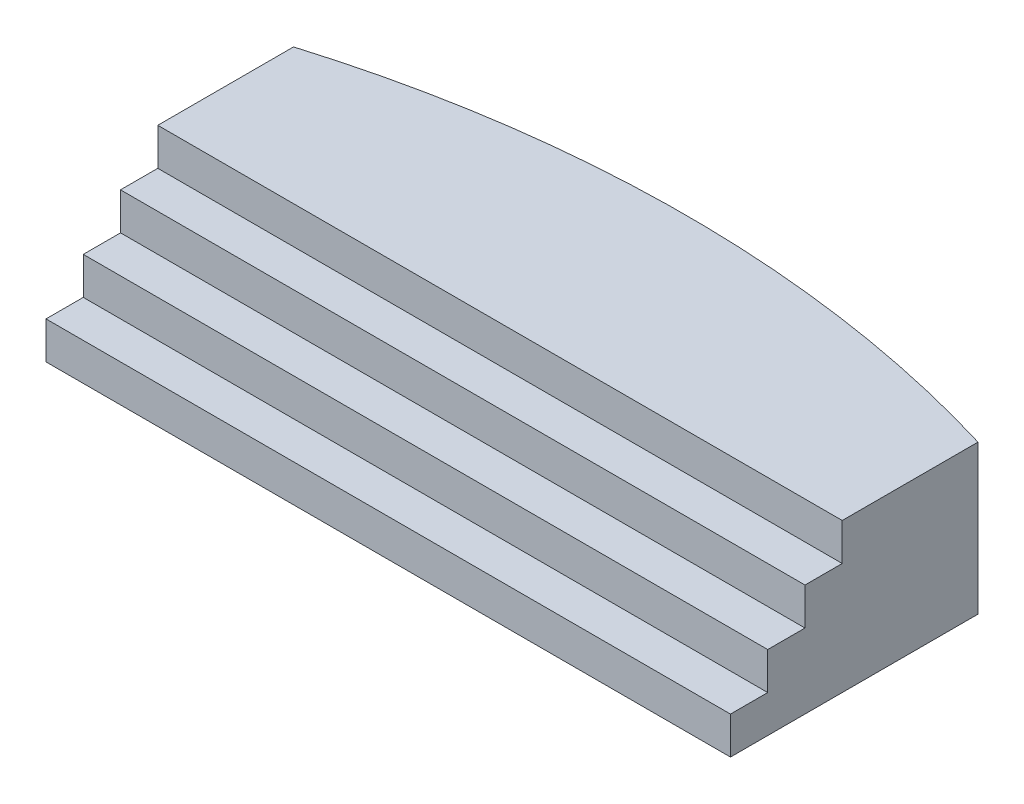
ISO-10303-21;
HEADER;
FILE_DESCRIPTION(('STEP AP214'),'2;1');
FILE_NAME('part.step','',(''),(''),'','','');
FILE_SCHEMA(('AUTOMOTIVE_DESIGN { 1 0 10303 214 1 1 1 1 }'));
ENDSEC;
DATA;
#1=APPLICATION_CONTEXT('core data for automotive mechanical design processes');
#2=APPLICATION_PROTOCOL_DEFINITION('international standard','automotive_design',2000,#1);
#3=PRODUCT_CONTEXT('',#1,'mechanical');
#4=PRODUCT('Part','Part','',(#3));
#5=PRODUCT_RELATED_PRODUCT_CATEGORY('part','',(#4));
#6=PRODUCT_DEFINITION_FORMATION('','',#4);
#7=PRODUCT_DEFINITION_CONTEXT('part definition',#1,'design');
#8=PRODUCT_DEFINITION('design','',#6,#7);
#9=PRODUCT_DEFINITION_SHAPE('','',#8);
#10=(LENGTH_UNIT() NAMED_UNIT(*) SI_UNIT(.MILLI.,.METRE.));
#11=(NAMED_UNIT(*) PLANE_ANGLE_UNIT() SI_UNIT($,.RADIAN.));
#12=(NAMED_UNIT(*) SI_UNIT($,.STERADIAN.) SOLID_ANGLE_UNIT());
#13=UNCERTAINTY_MEASURE_WITH_UNIT(LENGTH_MEASURE(1.E-05),#10,'distance_accuracy_value','');
#14=(GEOMETRIC_REPRESENTATION_CONTEXT(3) GLOBAL_UNCERTAINTY_ASSIGNED_CONTEXT((#13)) GLOBAL_UNIT_ASSIGNED_CONTEXT((#10,
#11,#12)) REPRESENTATION_CONTEXT('',''));
#15=CARTESIAN_POINT('',(0.,0.,0.));
#16=DIRECTION('',(0.,0.,1.));
#17=DIRECTION('',(1.,0.,0.));
#18=AXIS2_PLACEMENT_3D('',#15,#16,#17);
#19=CARTESIAN_POINT('',(0.,1000.,0.));
#20=DIRECTION('',(0.,-1.,0.));
#21=DIRECTION('',(0.,0.,-1.));
#22=AXIS2_PLACEMENT_3D('',#19,#20,#21);
#23=CYLINDRICAL_SURFACE('',#22,7945.75);
#24=DIRECTION('',(0.,-1.,0.));
#25=VECTOR('',#24,1.);
#26=CARTESIAN_POINT('',(2296.3939,1000.,-7606.67589151416));
#27=LINE('',#26,#25);
#28=CARTESIAN_POINT('',(2296.3939,0.,-7606.67589151416));
#29=VERTEX_POINT('',#28);
#30=CARTESIAN_POINT('',(2296.3939,1000.,-7606.67589151416));
#31=VERTEX_POINT('',#30);
#32=EDGE_CURVE('E153',#29,#31,#27,.F.);
#33=ORIENTED_EDGE('',*,*,#32,.F.);
#34=CARTESIAN_POINT('',(0.,0.,0.));
#35=DIRECTION('',(0.,1.,0.));
#36=DIRECTION('',(0.,0.,1.));
#37=AXIS2_PLACEMENT_3D('',#34,#35,#36);
#38=CIRCLE('',#37,7945.75);
#39=CARTESIAN_POINT('',(-2296.3939,0.,-7606.67589151416));
#40=VERTEX_POINT('',#39);
#41=EDGE_CURVE('E163',#29,#40,#38,.T.);
#42=ORIENTED_EDGE('',*,*,#41,.T.);
#43=DIRECTION('',(0.,-1.,0.));
#44=VECTOR('',#43,1.);
#45=CARTESIAN_POINT('',(-2296.3939,1000.,-7606.67589151416));
#46=LINE('',#45,#44);
#47=CARTESIAN_POINT('',(-2296.3939,1000.,-7606.67589151416));
#48=VERTEX_POINT('',#47);
#49=EDGE_CURVE('E69',#48,#40,#46,.T.);
#50=ORIENTED_EDGE('',*,*,#49,.F.);
#51=CARTESIAN_POINT('',(0.,1000.,0.));
#52=DIRECTION('',(0.,1.,0.));
#53=DIRECTION('',(0.,0.,1.));
#54=AXIS2_PLACEMENT_3D('',#51,#52,#53);
#55=CIRCLE('',#54,7945.75);
#56=EDGE_CURVE('E164',#31,#48,#55,.T.);
#57=ORIENTED_EDGE('',*,*,#56,.F.);
#58=EDGE_LOOP('',(#33,#42,#50,#57));
#59=FACE_BOUND('',#58,.T.);
#60=ADVANCED_FACE('F46',(#59),#23,.T.);
#61=CARTESIAN_POINT('',(0.,1000.,0.));
#62=DIRECTION('',(0.,1.,0.));
#63=DIRECTION('',(0.,0.,1.));
#64=AXIS2_PLACEMENT_3D('',#61,#62,#63);
#65=PLANE('',#64);
#66=DIRECTION('',(1.,0.,0.));
#67=VECTOR('',#66,1.);
#68=CARTESIAN_POINT('',(-2703.6061,1000.,-6695.75));
#69=LINE('',#68,#67);
#70=CARTESIAN_POINT('',(-2296.3939,1000.,-6695.75));
#71=VERTEX_POINT('',#70);
#72=CARTESIAN_POINT('',(2296.3939,1000.,-6695.75));
#73=VERTEX_POINT('',#72);
#74=EDGE_CURVE('E223',#71,#73,#69,.T.);
#75=ORIENTED_EDGE('',*,*,#74,.T.);
#76=DIRECTION('',(0.,0.,-1.));
#77=VECTOR('',#76,1.);
#78=CARTESIAN_POINT('',(2296.3939,1000.,-9945.75));
#79=LINE('',#78,#77);
#80=EDGE_CURVE('E222',#73,#31,#79,.T.);
#81=ORIENTED_EDGE('',*,*,#80,.T.);
#82=ORIENTED_EDGE('',*,*,#56,.T.);
#83=DIRECTION('',(0.,0.,1.));
#84=VECTOR('',#83,1.);
#85=CARTESIAN_POINT('',(-2296.3939,1000.,-9945.75));
#86=LINE('',#85,#84);
#87=EDGE_CURVE('E157',#48,#71,#86,.T.);
#88=ORIENTED_EDGE('',*,*,#87,.T.);
#89=EDGE_LOOP('',(#75,#81,#82,#88));
#90=FACE_BOUND('',#89,.T.);
#91=ADVANCED_FACE('F234',(#90),#65,.T.);
#92=CARTESIAN_POINT('',(0.,0.,0.));
#93=DIRECTION('',(0.,1.,0.));
#94=DIRECTION('',(0.,0.,1.));
#95=AXIS2_PLACEMENT_3D('',#92,#93,#94);
#96=PLANE('',#95);
#97=DIRECTION('',(0.,0.,-1.));
#98=VECTOR('',#97,1.);
#99=CARTESIAN_POINT('',(2296.3939,0.,-9945.75));
#100=LINE('',#99,#98);
#101=CARTESIAN_POINT('',(2296.3939,0.,-5945.75));
#102=VERTEX_POINT('',#101);
#103=EDGE_CURVE('E224',#102,#29,#100,.T.);
#104=ORIENTED_EDGE('',*,*,#103,.F.);
#105=DIRECTION('',(1.,0.,0.));
#106=VECTOR('',#105,1.);
#107=CARTESIAN_POINT('',(-2296.3939,0.,-5945.75));
#108=LINE('',#107,#106);
#109=CARTESIAN_POINT('',(-2296.3939,0.,-5945.75));
#110=VERTEX_POINT('',#109);
#111=EDGE_CURVE('E146',#110,#102,#108,.T.);
#112=ORIENTED_EDGE('',*,*,#111,.F.);
#113=DIRECTION('',(0.,0.,1.));
#114=VECTOR('',#113,1.);
#115=CARTESIAN_POINT('',(-2296.3939,0.,2.54950938138876E-13));
#116=LINE('',#115,#114);
#117=EDGE_CURVE('E132',#40,#110,#116,.T.);
#118=ORIENTED_EDGE('',*,*,#117,.F.);
#119=ORIENTED_EDGE('',*,*,#41,.F.);
#120=EDGE_LOOP('',(#104,#112,#118,#119));
#121=FACE_BOUND('',#120,.T.);
#122=ADVANCED_FACE('F240',(#121),#96,.F.);
#123=CARTESIAN_POINT('',(2296.3939,0.,-9945.75));
#124=DIRECTION('',(1.,0.,0.));
#125=DIRECTION('',(0.,0.,-1.));
#126=AXIS2_PLACEMENT_3D('',#123,#124,#125);
#127=PLANE('',#126);
#128=DIRECTION('',(0.,1.,0.));
#129=VECTOR('',#128,1.);
#130=CARTESIAN_POINT('',(2296.3939,750.,-6695.75));
#131=LINE('',#130,#129);
#132=CARTESIAN_POINT('',(2296.3939,750.,-6695.75));
#133=VERTEX_POINT('',#132);
#134=EDGE_CURVE('E217',#133,#73,#131,.T.);
#135=ORIENTED_EDGE('',*,*,#134,.F.);
#136=DIRECTION('',(0.,0.,-1.));
#137=VECTOR('',#136,1.);
#138=CARTESIAN_POINT('',(2296.3939,750.,-6445.75));
#139=LINE('',#138,#137);
#140=CARTESIAN_POINT('',(2296.3939,750.,-6445.75));
#141=VERTEX_POINT('',#140);
#142=EDGE_CURVE('E241',#141,#133,#139,.T.);
#143=ORIENTED_EDGE('',*,*,#142,.F.);
#144=DIRECTION('',(0.,1.,0.));
#145=VECTOR('',#144,1.);
#146=CARTESIAN_POINT('',(2296.3939,500.,-6445.75));
#147=LINE('',#146,#145);
#148=CARTESIAN_POINT('',(2296.3939,500.,-6445.75));
#149=VERTEX_POINT('',#148);
#150=EDGE_CURVE('E196',#149,#141,#147,.T.);
#151=ORIENTED_EDGE('',*,*,#150,.F.);
#152=DIRECTION('',(0.,0.,-1.));
#153=VECTOR('',#152,1.);
#154=CARTESIAN_POINT('',(2296.3939,500.,-6195.75));
#155=LINE('',#154,#153);
#156=CARTESIAN_POINT('',(2296.3939,500.,-6195.75));
#157=VERTEX_POINT('',#156);
#158=EDGE_CURVE('E349',#157,#149,#155,.T.);
#159=ORIENTED_EDGE('',*,*,#158,.F.);
#160=DIRECTION('',(0.,1.,0.));
#161=VECTOR('',#160,1.);
#162=CARTESIAN_POINT('',(2296.3939,250.,-6195.75));
#163=LINE('',#162,#161);
#164=CARTESIAN_POINT('',(2296.3939,250.,-6195.75));
#165=VERTEX_POINT('',#164);
#166=EDGE_CURVE('E141',#165,#157,#163,.T.);
#167=ORIENTED_EDGE('',*,*,#166,.F.);
#168=DIRECTION('',(0.,0.,-1.));
#169=VECTOR('',#168,1.);
#170=CARTESIAN_POINT('',(2296.3939,250.,-5945.75));
#171=LINE('',#170,#169);
#172=CARTESIAN_POINT('',(2296.3939,250.,-5945.75));
#173=VERTEX_POINT('',#172);
#174=EDGE_CURVE('E124',#173,#165,#171,.T.);
#175=ORIENTED_EDGE('',*,*,#174,.F.);
#176=DIRECTION('',(0.,1.,0.));
#177=VECTOR('',#176,1.);
#178=CARTESIAN_POINT('',(2296.3939,0.,-5945.75));
#179=LINE('',#178,#177);
#180=EDGE_CURVE('E137',#102,#173,#179,.T.);
#181=ORIENTED_EDGE('',*,*,#180,.F.);
#182=ORIENTED_EDGE('',*,*,#103,.T.);
#183=ORIENTED_EDGE('',*,*,#32,.T.);
#184=ORIENTED_EDGE('',*,*,#80,.F.);
#185=EDGE_LOOP('',(#135,#143,#151,#159,#167,#175,#181,#182,#183,#184));
#186=FACE_BOUND('',#185,.T.);
#187=ADVANCED_FACE('F136',(#186),#127,.T.);
#188=CARTESIAN_POINT('',(-2296.3939,0.,-9945.75));
#189=DIRECTION('',(-1.,0.,0.));
#190=DIRECTION('',(0.,0.,1.));
#191=AXIS2_PLACEMENT_3D('',#188,#189,#190);
#192=PLANE('',#191);
#193=DIRECTION('',(0.,-1.,0.));
#194=VECTOR('',#193,1.);
#195=CARTESIAN_POINT('',(-2296.3939,0.,-6695.75));
#196=LINE('',#195,#194);
#197=CARTESIAN_POINT('',(-2296.3939,750.,-6695.75));
#198=VERTEX_POINT('',#197);
#199=EDGE_CURVE('E12',#71,#198,#196,.T.);
#200=ORIENTED_EDGE('',*,*,#199,.F.);
#201=ORIENTED_EDGE('',*,*,#87,.F.);
#202=ORIENTED_EDGE('',*,*,#49,.T.);
#203=ORIENTED_EDGE('',*,*,#117,.T.);
#204=DIRECTION('',(0.,1.,0.));
#205=VECTOR('',#204,1.);
#206=CARTESIAN_POINT('',(-2296.3939,0.,-5945.75));
#207=LINE('',#206,#205);
#208=CARTESIAN_POINT('',(-2296.3939,250.,-5945.75));
#209=VERTEX_POINT('',#208);
#210=EDGE_CURVE('E149',#110,#209,#207,.T.);
#211=ORIENTED_EDGE('',*,*,#210,.T.);
#212=DIRECTION('',(0.,0.,1.));
#213=VECTOR('',#212,1.);
#214=CARTESIAN_POINT('',(-2296.3939,250.,-9945.75));
#215=LINE('',#214,#213);
#216=CARTESIAN_POINT('',(-2296.3939,250.,-6195.75));
#217=VERTEX_POINT('',#216);
#218=EDGE_CURVE('E61',#217,#209,#215,.T.);
#219=ORIENTED_EDGE('',*,*,#218,.F.);
#220=DIRECTION('',(0.,-1.,0.));
#221=VECTOR('',#220,1.);
#222=CARTESIAN_POINT('',(-2296.3939,0.,-6195.75));
#223=LINE('',#222,#221);
#224=CARTESIAN_POINT('',(-2296.3939,500.,-6195.75));
#225=VERTEX_POINT('',#224);
#226=EDGE_CURVE('E131',#225,#217,#223,.T.);
#227=ORIENTED_EDGE('',*,*,#226,.F.);
#228=DIRECTION('',(0.,0.,1.));
#229=VECTOR('',#228,1.);
#230=CARTESIAN_POINT('',(-2296.3939,500.,-9945.75));
#231=LINE('',#230,#229);
#232=CARTESIAN_POINT('',(-2296.3939,500.,-6445.75));
#233=VERTEX_POINT('',#232);
#234=EDGE_CURVE('E175',#233,#225,#231,.T.);
#235=ORIENTED_EDGE('',*,*,#234,.F.);
#236=DIRECTION('',(0.,-1.,0.));
#237=VECTOR('',#236,1.);
#238=CARTESIAN_POINT('',(-2296.3939,0.,-6445.75));
#239=LINE('',#238,#237);
#240=CARTESIAN_POINT('',(-2296.3939,750.,-6445.75));
#241=VERTEX_POINT('',#240);
#242=EDGE_CURVE('E178',#241,#233,#239,.T.);
#243=ORIENTED_EDGE('',*,*,#242,.F.);
#244=DIRECTION('',(0.,0.,1.));
#245=VECTOR('',#244,1.);
#246=CARTESIAN_POINT('',(-2296.3939,750.,-9945.75));
#247=LINE('',#246,#245);
#248=EDGE_CURVE('E54',#198,#241,#247,.T.);
#249=ORIENTED_EDGE('',*,*,#248,.F.);
#250=EDGE_LOOP('',(#200,#201,#202,#203,#211,#219,#227,#235,#243,#249));
#251=FACE_BOUND('',#250,.T.);
#252=ADVANCED_FACE('F202',(#251),#192,.T.);
#253=CARTESIAN_POINT('',(-2296.3939,0.,-5945.75));
#254=DIRECTION('',(0.,0.,1.));
#255=DIRECTION('',(1.,0.,0.));
#256=AXIS2_PLACEMENT_3D('',#253,#254,#255);
#257=PLANE('',#256);
#258=DIRECTION('',(1.,0.,0.));
#259=VECTOR('',#258,1.);
#260=CARTESIAN_POINT('',(-2296.3939,250.,-5945.75));
#261=LINE('',#260,#259);
#262=EDGE_CURVE('E121',#209,#173,#261,.T.);
#263=ORIENTED_EDGE('',*,*,#262,.F.);
#264=ORIENTED_EDGE('',*,*,#210,.F.);
#265=ORIENTED_EDGE('',*,*,#111,.T.);
#266=ORIENTED_EDGE('',*,*,#180,.T.);
#267=EDGE_LOOP('',(#263,#264,#265,#266));
#268=FACE_BOUND('',#267,.T.);
#269=ADVANCED_FACE('F144',(#268),#257,.T.);
#270=CARTESIAN_POINT('',(-2703.6061,750.,-6695.75));
#271=DIRECTION('',(0.,0.,-1.));
#272=DIRECTION('',(-1.,0.,0.));
#273=AXIS2_PLACEMENT_3D('',#270,#271,#272);
#274=PLANE('',#273);
#275=ORIENTED_EDGE('',*,*,#199,.T.);
#276=DIRECTION('',(1.,0.,0.));
#277=VECTOR('',#276,1.);
#278=CARTESIAN_POINT('',(-2703.6061,750.,-6695.75));
#279=LINE('',#278,#277);
#280=EDGE_CURVE('E189',#198,#133,#279,.T.);
#281=ORIENTED_EDGE('',*,*,#280,.T.);
#282=ORIENTED_EDGE('',*,*,#134,.T.);
#283=ORIENTED_EDGE('',*,*,#74,.F.);
#284=EDGE_LOOP('',(#275,#281,#282,#283));
#285=FACE_BOUND('',#284,.T.);
#286=ADVANCED_FACE('F252',(#285),#274,.F.);
#287=CARTESIAN_POINT('',(-2703.6061,750.,-6445.75));
#288=DIRECTION('',(0.,-1.,0.));
#289=DIRECTION('',(0.,0.,-1.));
#290=AXIS2_PLACEMENT_3D('',#287,#288,#289);
#291=PLANE('',#290);
#292=ORIENTED_EDGE('',*,*,#248,.T.);
#293=DIRECTION('',(1.,0.,0.));
#294=VECTOR('',#293,1.);
#295=CARTESIAN_POINT('',(-2703.6061,750.,-6445.75));
#296=LINE('',#295,#294);
#297=EDGE_CURVE('E187',#241,#141,#296,.T.);
#298=ORIENTED_EDGE('',*,*,#297,.T.);
#299=ORIENTED_EDGE('',*,*,#142,.T.);
#300=ORIENTED_EDGE('',*,*,#280,.F.);
#301=EDGE_LOOP('',(#292,#298,#299,#300));
#302=FACE_BOUND('',#301,.T.);
#303=ADVANCED_FACE('F185',(#302),#291,.F.);
#304=CARTESIAN_POINT('',(-2703.6061,500.,-6445.75));
#305=DIRECTION('',(0.,0.,-1.));
#306=DIRECTION('',(-1.,0.,0.));
#307=AXIS2_PLACEMENT_3D('',#304,#305,#306);
#308=PLANE('',#307);
#309=ORIENTED_EDGE('',*,*,#242,.T.);
#310=DIRECTION('',(1.,0.,0.));
#311=VECTOR('',#310,1.);
#312=CARTESIAN_POINT('',(-2703.6061,500.,-6445.75));
#313=LINE('',#312,#311);
#314=EDGE_CURVE('E199',#233,#149,#313,.T.);
#315=ORIENTED_EDGE('',*,*,#314,.T.);
#316=ORIENTED_EDGE('',*,*,#150,.T.);
#317=ORIENTED_EDGE('',*,*,#297,.F.);
#318=EDGE_LOOP('',(#309,#315,#316,#317));
#319=FACE_BOUND('',#318,.T.);
#320=ADVANCED_FACE('F193',(#319),#308,.F.);
#321=CARTESIAN_POINT('',(-2703.6061,500.,-6195.75));
#322=DIRECTION('',(0.,-1.,0.));
#323=DIRECTION('',(0.,0.,-1.));
#324=AXIS2_PLACEMENT_3D('',#321,#322,#323);
#325=PLANE('',#324);
#326=ORIENTED_EDGE('',*,*,#234,.T.);
#327=DIRECTION('',(1.,0.,0.));
#328=VECTOR('',#327,1.);
#329=CARTESIAN_POINT('',(-2703.6061,500.,-6195.75));
#330=LINE('',#329,#328);
#331=EDGE_CURVE('E208',#225,#157,#330,.T.);
#332=ORIENTED_EDGE('',*,*,#331,.T.);
#333=ORIENTED_EDGE('',*,*,#158,.T.);
#334=ORIENTED_EDGE('',*,*,#314,.F.);
#335=EDGE_LOOP('',(#326,#332,#333,#334));
#336=FACE_BOUND('',#335,.T.);
#337=ADVANCED_FACE('F206',(#336),#325,.F.);
#338=CARTESIAN_POINT('',(-2703.6061,250.,-6195.75));
#339=DIRECTION('',(0.,0.,-1.));
#340=DIRECTION('',(-1.,0.,0.));
#341=AXIS2_PLACEMENT_3D('',#338,#339,#340);
#342=PLANE('',#341);
#343=ORIENTED_EDGE('',*,*,#226,.T.);
#344=DIRECTION('',(1.,0.,0.));
#345=VECTOR('',#344,1.);
#346=CARTESIAN_POINT('',(-2703.6061,250.,-6195.75));
#347=LINE('',#346,#345);
#348=EDGE_CURVE('E212',#217,#165,#347,.T.);
#349=ORIENTED_EDGE('',*,*,#348,.T.);
#350=ORIENTED_EDGE('',*,*,#166,.T.);
#351=ORIENTED_EDGE('',*,*,#331,.F.);
#352=EDGE_LOOP('',(#343,#349,#350,#351));
#353=FACE_BOUND('',#352,.T.);
#354=ADVANCED_FACE('F210',(#353),#342,.F.);
#355=CARTESIAN_POINT('',(-2703.6061,250.,-5945.75));
#356=DIRECTION('',(0.,-1.,0.));
#357=DIRECTION('',(0.,0.,-1.));
#358=AXIS2_PLACEMENT_3D('',#355,#356,#357);
#359=PLANE('',#358);
#360=ORIENTED_EDGE('',*,*,#218,.T.);
#361=ORIENTED_EDGE('',*,*,#262,.T.);
#362=ORIENTED_EDGE('',*,*,#174,.T.);
#363=ORIENTED_EDGE('',*,*,#348,.F.);
#364=EDGE_LOOP('',(#360,#361,#362,#363));
#365=FACE_BOUND('',#364,.T.);
#366=ADVANCED_FACE('F123',(#365),#359,.F.);
#367=CLOSED_SHELL('',(#60,#91,#122,#187,#252,#269,#286,#303,#320,#337,#354,#366));
#368=MANIFOLD_SOLID_BREP('B2',#367);
#369=ADVANCED_BREP_SHAPE_REPRESENTATION('',(#18,#368),#14);
#370=SHAPE_DEFINITION_REPRESENTATION(#9,#369);
ENDSEC;
END-ISO-10303-21;
